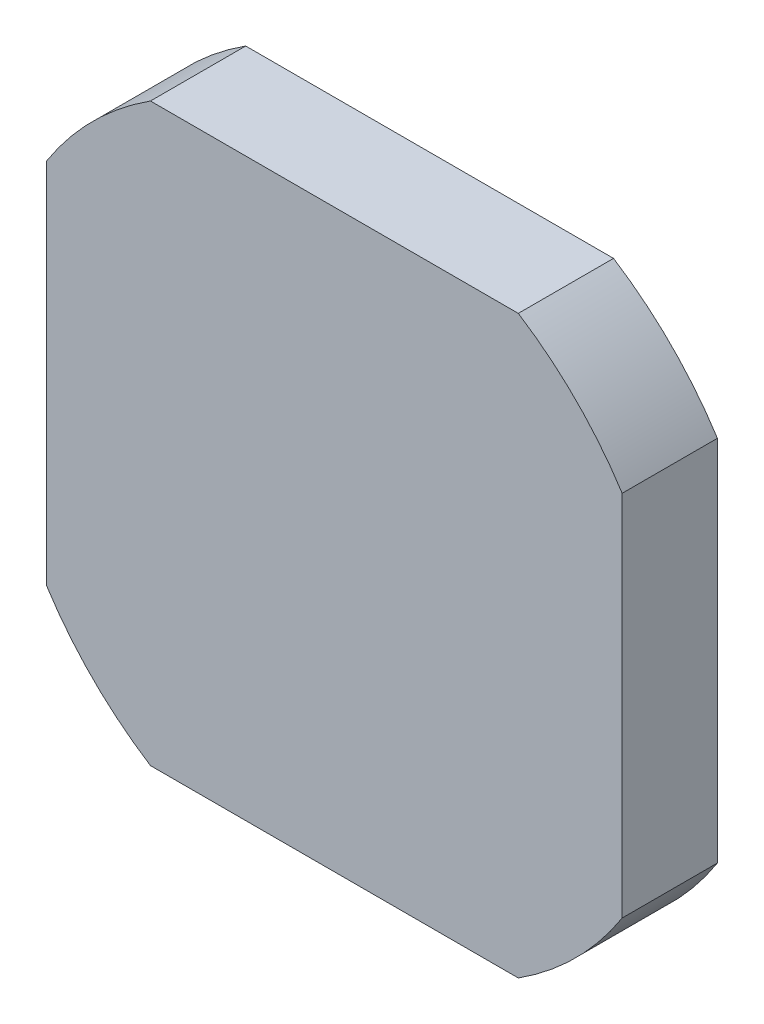
ISO-10303-21;
HEADER;
FILE_DESCRIPTION(('STEP AP214'),'2;1');
FILE_NAME('part.step','',(''),(''),'','','');
FILE_SCHEMA(('AUTOMOTIVE_DESIGN { 1 0 10303 214 1 1 1 1 }'));
ENDSEC;
DATA;
#1=APPLICATION_CONTEXT('core data for automotive mechanical design processes');
#2=APPLICATION_PROTOCOL_DEFINITION('international standard','automotive_design',2000,#1);
#3=PRODUCT_CONTEXT('',#1,'mechanical');
#4=PRODUCT('Part','Part','',(#3));
#5=PRODUCT_RELATED_PRODUCT_CATEGORY('part','',(#4));
#6=PRODUCT_DEFINITION_FORMATION('','',#4);
#7=PRODUCT_DEFINITION_CONTEXT('part definition',#1,'design');
#8=PRODUCT_DEFINITION('design','',#6,#7);
#9=PRODUCT_DEFINITION_SHAPE('','',#8);
#10=(LENGTH_UNIT() NAMED_UNIT(*) SI_UNIT(.MILLI.,.METRE.));
#11=(NAMED_UNIT(*) PLANE_ANGLE_UNIT() SI_UNIT($,.RADIAN.));
#12=(NAMED_UNIT(*) SI_UNIT($,.STERADIAN.) SOLID_ANGLE_UNIT());
#13=UNCERTAINTY_MEASURE_WITH_UNIT(LENGTH_MEASURE(1.E-05),#10,'distance_accuracy_value','');
#14=(GEOMETRIC_REPRESENTATION_CONTEXT(3) GLOBAL_UNCERTAINTY_ASSIGNED_CONTEXT((#13)) GLOBAL_UNIT_ASSIGNED_CONTEXT((#10,
#11,#12)) REPRESENTATION_CONTEXT('',''));
#15=CARTESIAN_POINT('',(0.,0.,0.));
#16=DIRECTION('',(0.,0.,1.));
#17=DIRECTION('',(1.,0.,0.));
#18=AXIS2_PLACEMENT_3D('',#15,#16,#17);
#19=CARTESIAN_POINT('',(-21.15,17.15,7.));
#20=DIRECTION('',(1.,0.,0.));
#21=DIRECTION('',(0.,1.,0.));
#22=AXIS2_PLACEMENT_3D('',#19,#20,#21);
#23=PLANE('',#22);
#24=DIRECTION('',(0.,0.,1.));
#25=VECTOR('',#24,1.);
#26=CARTESIAN_POINT('',(-21.15,13.5161939909133,0.));
#27=LINE('',#26,#25);
#28=CARTESIAN_POINT('',(-21.15,13.5161939909133,0.));
#29=VERTEX_POINT('',#28);
#30=CARTESIAN_POINT('',(-21.15,13.5161939909133,7.));
#31=VERTEX_POINT('',#30);
#32=EDGE_CURVE('E133',#29,#31,#27,.T.);
#33=ORIENTED_EDGE('',*,*,#32,.F.);
#34=DIRECTION('',(0.,-1.,0.));
#35=VECTOR('',#34,1.);
#36=CARTESIAN_POINT('',(-21.15,17.15,0.));
#37=LINE('',#36,#35);
#38=CARTESIAN_POINT('',(-21.15,-13.5161939909133,0.));
#39=VERTEX_POINT('',#38);
#40=EDGE_CURVE('E130',#29,#39,#37,.T.);
#41=ORIENTED_EDGE('',*,*,#40,.T.);
#42=DIRECTION('',(0.,0.,1.));
#43=VECTOR('',#42,1.);
#44=CARTESIAN_POINT('',(-21.15,-13.5161939909133,0.));
#45=LINE('',#44,#43);
#46=CARTESIAN_POINT('',(-21.15,-13.5161939909133,7.));
#47=VERTEX_POINT('',#46);
#48=EDGE_CURVE('E141',#47,#39,#45,.F.);
#49=ORIENTED_EDGE('',*,*,#48,.F.);
#50=DIRECTION('',(0.,-1.,0.));
#51=VECTOR('',#50,1.);
#52=CARTESIAN_POINT('',(-21.15,17.15,7.));
#53=LINE('',#52,#51);
#54=EDGE_CURVE('E120',#31,#47,#53,.T.);
#55=ORIENTED_EDGE('',*,*,#54,.F.);
#56=EDGE_LOOP('',(#33,#41,#49,#55));
#57=FACE_BOUND('',#56,.T.);
#58=ADVANCED_FACE('F35',(#57),#23,.F.);
#59=CARTESIAN_POINT('',(-17.15,-21.15,7.));
#60=DIRECTION('',(0.,1.,0.));
#61=DIRECTION('',(0.,0.,1.));
#62=AXIS2_PLACEMENT_3D('',#59,#60,#61);
#63=PLANE('',#62);
#64=DIRECTION('',(0.,0.,1.));
#65=VECTOR('',#64,1.);
#66=CARTESIAN_POINT('',(-13.5161939909133,-21.15,0.));
#67=LINE('',#66,#65);
#68=CARTESIAN_POINT('',(-13.5161939909133,-21.15,0.));
#69=VERTEX_POINT('',#68);
#70=CARTESIAN_POINT('',(-13.5161939909133,-21.15,7.));
#71=VERTEX_POINT('',#70);
#72=EDGE_CURVE('E143',#69,#71,#67,.T.);
#73=ORIENTED_EDGE('',*,*,#72,.F.);
#74=DIRECTION('',(1.,0.,0.));
#75=VECTOR('',#74,1.);
#76=CARTESIAN_POINT('',(-17.15,-21.15,0.));
#77=LINE('',#76,#75);
#78=CARTESIAN_POINT('',(13.5161939909133,-21.15,0.));
#79=VERTEX_POINT('',#78);
#80=EDGE_CURVE('E125',#69,#79,#77,.T.);
#81=ORIENTED_EDGE('',*,*,#80,.T.);
#82=DIRECTION('',(0.,0.,1.));
#83=VECTOR('',#82,1.);
#84=CARTESIAN_POINT('',(13.5161939909133,-21.15,0.));
#85=LINE('',#84,#83);
#86=CARTESIAN_POINT('',(13.5161939909133,-21.15,7.));
#87=VERTEX_POINT('',#86);
#88=EDGE_CURVE('E50',#87,#79,#85,.F.);
#89=ORIENTED_EDGE('',*,*,#88,.F.);
#90=DIRECTION('',(1.,0.,0.));
#91=VECTOR('',#90,1.);
#92=CARTESIAN_POINT('',(-17.15,-21.15,7.));
#93=LINE('',#92,#91);
#94=EDGE_CURVE('E123',#71,#87,#93,.T.);
#95=ORIENTED_EDGE('',*,*,#94,.F.);
#96=EDGE_LOOP('',(#73,#81,#89,#95));
#97=FACE_BOUND('',#96,.T.);
#98=ADVANCED_FACE('F165',(#97),#63,.F.);
#99=CARTESIAN_POINT('',(21.15,17.15,7.));
#100=DIRECTION('',(-1.,0.,0.));
#101=DIRECTION('',(0.,-1.,0.));
#102=AXIS2_PLACEMENT_3D('',#99,#100,#101);
#103=PLANE('',#102);
#104=DIRECTION('',(0.,0.,1.));
#105=VECTOR('',#104,1.);
#106=CARTESIAN_POINT('',(21.15,-13.5161939909133,0.));
#107=LINE('',#106,#105);
#108=CARTESIAN_POINT('',(21.15,-13.5161939909133,0.));
#109=VERTEX_POINT('',#108);
#110=CARTESIAN_POINT('',(21.15,-13.5161939909133,7.));
#111=VERTEX_POINT('',#110);
#112=EDGE_CURVE('E146',#109,#111,#107,.T.);
#113=ORIENTED_EDGE('',*,*,#112,.F.);
#114=DIRECTION('',(0.,1.,0.));
#115=VECTOR('',#114,1.);
#116=CARTESIAN_POINT('',(21.15,17.15,0.));
#117=LINE('',#116,#115);
#118=CARTESIAN_POINT('',(21.15,13.5161939909133,0.));
#119=VERTEX_POINT('',#118);
#120=EDGE_CURVE('E121',#109,#119,#117,.T.);
#121=ORIENTED_EDGE('',*,*,#120,.T.);
#122=DIRECTION('',(0.,0.,1.));
#123=VECTOR('',#122,1.);
#124=CARTESIAN_POINT('',(21.15,13.5161939909133,0.));
#125=LINE('',#124,#123);
#126=CARTESIAN_POINT('',(21.15,13.5161939909133,7.));
#127=VERTEX_POINT('',#126);
#128=EDGE_CURVE('E58',#127,#119,#125,.F.);
#129=ORIENTED_EDGE('',*,*,#128,.F.);
#130=DIRECTION('',(0.,1.,0.));
#131=VECTOR('',#130,1.);
#132=CARTESIAN_POINT('',(21.15,17.15,7.));
#133=LINE('',#132,#131);
#134=EDGE_CURVE('E135',#111,#127,#133,.T.);
#135=ORIENTED_EDGE('',*,*,#134,.F.);
#136=EDGE_LOOP('',(#113,#121,#129,#135));
#137=FACE_BOUND('',#136,.T.);
#138=ADVANCED_FACE('F186',(#137),#103,.F.);
#139=CARTESIAN_POINT('',(-17.15,21.15,7.));
#140=DIRECTION('',(0.,-1.,0.));
#141=DIRECTION('',(0.,0.,-1.));
#142=AXIS2_PLACEMENT_3D('',#139,#140,#141);
#143=PLANE('',#142);
#144=DIRECTION('',(0.,0.,1.));
#145=VECTOR('',#144,1.);
#146=CARTESIAN_POINT('',(13.5161939909133,21.15,0.));
#147=LINE('',#146,#145);
#148=CARTESIAN_POINT('',(13.5161939909133,21.15,0.));
#149=VERTEX_POINT('',#148);
#150=CARTESIAN_POINT('',(13.5161939909133,21.15,7.));
#151=VERTEX_POINT('',#150);
#152=EDGE_CURVE('E99',#149,#151,#147,.T.);
#153=ORIENTED_EDGE('',*,*,#152,.F.);
#154=DIRECTION('',(-1.,0.,0.));
#155=VECTOR('',#154,1.);
#156=CARTESIAN_POINT('',(-17.15,21.15,0.));
#157=LINE('',#156,#155);
#158=CARTESIAN_POINT('',(-13.5161939909133,21.15,0.));
#159=VERTEX_POINT('',#158);
#160=EDGE_CURVE('E113',#149,#159,#157,.T.);
#161=ORIENTED_EDGE('',*,*,#160,.T.);
#162=DIRECTION('',(0.,0.,1.));
#163=VECTOR('',#162,1.);
#164=CARTESIAN_POINT('',(-13.5161939909133,21.15,0.));
#165=LINE('',#164,#163);
#166=CARTESIAN_POINT('',(-13.5161939909133,21.15,7.));
#167=VERTEX_POINT('',#166);
#168=EDGE_CURVE('E105',#167,#159,#165,.F.);
#169=ORIENTED_EDGE('',*,*,#168,.F.);
#170=DIRECTION('',(-1.,0.,0.));
#171=VECTOR('',#170,1.);
#172=CARTESIAN_POINT('',(-17.15,21.15,7.));
#173=LINE('',#172,#171);
#174=EDGE_CURVE('E115',#151,#167,#173,.T.);
#175=ORIENTED_EDGE('',*,*,#174,.F.);
#176=EDGE_LOOP('',(#153,#161,#169,#175));
#177=FACE_BOUND('',#176,.T.);
#178=ADVANCED_FACE('F111',(#177),#143,.F.);
#179=CARTESIAN_POINT('',(0.,0.,7.));
#180=DIRECTION('',(0.,0.,1.));
#181=DIRECTION('',(1.,0.,0.));
#182=AXIS2_PLACEMENT_3D('',#179,#180,#181);
#183=PLANE('',#182);
#184=ORIENTED_EDGE('',*,*,#134,.T.);
#185=CARTESIAN_POINT('',(0.,0.,7.));
#186=DIRECTION('',(0.,0.,1.));
#187=DIRECTION('',(1.,0.,0.));
#188=AXIS2_PLACEMENT_3D('',#185,#186,#187);
#189=CIRCLE('',#188,25.1);
#190=EDGE_CURVE('E106',#127,#151,#189,.T.);
#191=ORIENTED_EDGE('',*,*,#190,.T.);
#192=ORIENTED_EDGE('',*,*,#174,.T.);
#193=EDGE_CURVE('E150',#167,#31,#189,.T.);
#194=ORIENTED_EDGE('',*,*,#193,.T.);
#195=ORIENTED_EDGE('',*,*,#54,.T.);
#196=EDGE_CURVE('E154',#47,#71,#189,.T.);
#197=ORIENTED_EDGE('',*,*,#196,.T.);
#198=ORIENTED_EDGE('',*,*,#94,.T.);
#199=EDGE_CURVE('E151',#87,#111,#189,.T.);
#200=ORIENTED_EDGE('',*,*,#199,.T.);
#201=EDGE_LOOP('',(#184,#191,#192,#194,#195,#197,#198,#200));
#202=FACE_BOUND('',#201,.T.);
#203=ADVANCED_FACE('F159',(#202),#183,.T.);
#204=CARTESIAN_POINT('',(0.,0.,0.));
#205=DIRECTION('',(0.,0.,1.));
#206=DIRECTION('',(1.,0.,0.));
#207=AXIS2_PLACEMENT_3D('',#204,#205,#206);
#208=PLANE('',#207);
#209=CARTESIAN_POINT('',(0.,0.,0.));
#210=DIRECTION('',(0.,0.,1.));
#211=DIRECTION('',(1.,0.,0.));
#212=AXIS2_PLACEMENT_3D('',#209,#210,#211);
#213=CIRCLE('',#212,25.1);
#214=EDGE_CURVE('E96',#119,#149,#213,.T.);
#215=ORIENTED_EDGE('',*,*,#214,.F.);
#216=ORIENTED_EDGE('',*,*,#120,.F.);
#217=CARTESIAN_POINT('',(0.,0.,0.));
#218=DIRECTION('',(0.,0.,1.));
#219=DIRECTION('',(1.,0.,0.));
#220=AXIS2_PLACEMENT_3D('',#217,#218,#219);
#221=CIRCLE('',#220,25.1);
#222=EDGE_CURVE('E38',#79,#109,#221,.T.);
#223=ORIENTED_EDGE('',*,*,#222,.F.);
#224=ORIENTED_EDGE('',*,*,#80,.F.);
#225=EDGE_CURVE('E43',#39,#69,#221,.T.);
#226=ORIENTED_EDGE('',*,*,#225,.F.);
#227=ORIENTED_EDGE('',*,*,#40,.F.);
#228=EDGE_CURVE('E12',#159,#29,#221,.T.);
#229=ORIENTED_EDGE('',*,*,#228,.F.);
#230=ORIENTED_EDGE('',*,*,#160,.F.);
#231=EDGE_LOOP('',(#215,#216,#223,#224,#226,#227,#229,#230));
#232=FACE_BOUND('',#231,.T.);
#233=ADVANCED_FACE('F118',(#232),#208,.F.);
#234=CARTESIAN_POINT('',(0.,0.,0.));
#235=DIRECTION('',(0.,0.,1.));
#236=DIRECTION('',(1.,0.,0.));
#237=AXIS2_PLACEMENT_3D('',#234,#235,#236);
#238=CYLINDRICAL_SURFACE('',#237,25.1);
#239=ORIENTED_EDGE('',*,*,#88,.T.);
#240=ORIENTED_EDGE('',*,*,#222,.T.);
#241=ORIENTED_EDGE('',*,*,#112,.T.);
#242=ORIENTED_EDGE('',*,*,#199,.F.);
#243=EDGE_LOOP('',(#239,#240,#241,#242));
#244=FACE_BOUND('',#243,.T.);
#245=ADVANCED_FACE('F180',(#244),#238,.T.);
#246=ORIENTED_EDGE('',*,*,#48,.T.);
#247=ORIENTED_EDGE('',*,*,#225,.T.);
#248=ORIENTED_EDGE('',*,*,#72,.T.);
#249=ORIENTED_EDGE('',*,*,#196,.F.);
#250=EDGE_LOOP('',(#246,#247,#248,#249));
#251=FACE_BOUND('',#250,.T.);
#252=ADVANCED_FACE('F169',(#251),#238,.T.);
#253=ORIENTED_EDGE('',*,*,#32,.T.);
#254=ORIENTED_EDGE('',*,*,#193,.F.);
#255=ORIENTED_EDGE('',*,*,#168,.T.);
#256=ORIENTED_EDGE('',*,*,#228,.T.);
#257=EDGE_LOOP('',(#253,#254,#255,#256));
#258=FACE_BOUND('',#257,.T.);
#259=ADVANCED_FACE('F173',(#258),#238,.T.);
#260=ORIENTED_EDGE('',*,*,#128,.T.);
#261=ORIENTED_EDGE('',*,*,#214,.T.);
#262=ORIENTED_EDGE('',*,*,#152,.T.);
#263=ORIENTED_EDGE('',*,*,#190,.F.);
#264=EDGE_LOOP('',(#260,#261,#262,#263));
#265=FACE_BOUND('',#264,.T.);
#266=ADVANCED_FACE('F98',(#265),#238,.T.);
#267=CLOSED_SHELL('',(#58,#98,#138,#178,#203,#233,#245,#252,#259,#266));
#268=MANIFOLD_SOLID_BREP('B2',#267);
#269=ADVANCED_BREP_SHAPE_REPRESENTATION('',(#18,#268),#14);
#270=SHAPE_DEFINITION_REPRESENTATION(#9,#269);
ENDSEC;
END-ISO-10303-21;
